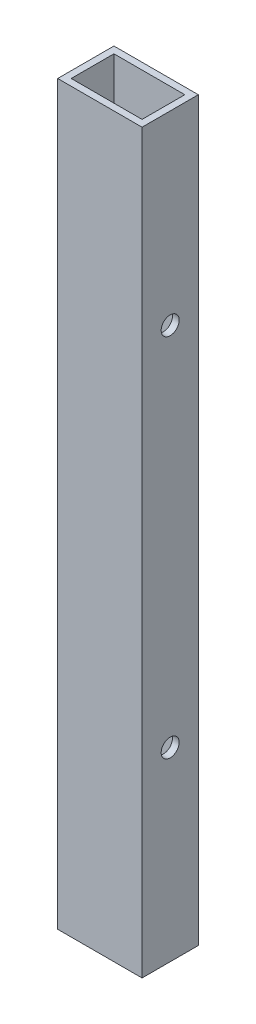
ISO-10303-21;
HEADER;
FILE_DESCRIPTION(('STEP AP214'),'2;1');
FILE_NAME('part.step','',(''),(''),'','','');
FILE_SCHEMA(('AUTOMOTIVE_DESIGN { 1 0 10303 214 1 1 1 1 }'));
ENDSEC;
DATA;
#1=APPLICATION_CONTEXT('core data for automotive mechanical design processes');
#2=APPLICATION_PROTOCOL_DEFINITION('international standard','automotive_design',2000,#1);
#3=PRODUCT_CONTEXT('',#1,'mechanical');
#4=PRODUCT('Part','Part','',(#3));
#5=PRODUCT_RELATED_PRODUCT_CATEGORY('part','',(#4));
#6=PRODUCT_DEFINITION_FORMATION('','',#4);
#7=PRODUCT_DEFINITION_CONTEXT('part definition',#1,'design');
#8=PRODUCT_DEFINITION('design','',#6,#7);
#9=PRODUCT_DEFINITION_SHAPE('','',#8);
#10=(LENGTH_UNIT() NAMED_UNIT(*) SI_UNIT(.MILLI.,.METRE.));
#11=(NAMED_UNIT(*) PLANE_ANGLE_UNIT() SI_UNIT($,.RADIAN.));
#12=(NAMED_UNIT(*) SI_UNIT($,.STERADIAN.) SOLID_ANGLE_UNIT());
#13=UNCERTAINTY_MEASURE_WITH_UNIT(LENGTH_MEASURE(1.E-05),#10,'distance_accuracy_value','');
#14=(GEOMETRIC_REPRESENTATION_CONTEXT(3) GLOBAL_UNCERTAINTY_ASSIGNED_CONTEXT((#13)) GLOBAL_UNIT_ASSIGNED_CONTEXT((#10,
#11,#12)) REPRESENTATION_CONTEXT('',''));
#15=CARTESIAN_POINT('',(0.,0.,0.));
#16=DIRECTION('',(0.,0.,1.));
#17=DIRECTION('',(1.,0.,0.));
#18=AXIS2_PLACEMENT_3D('',#15,#16,#17);
#19=CARTESIAN_POINT('',(0.,65.5,0.));
#20=DIRECTION('',(0.,1.,0.));
#21=DIRECTION('',(0.,0.,1.));
#22=AXIS2_PLACEMENT_3D('',#19,#20,#21);
#23=PLANE('',#22);
#24=DIRECTION('',(0.,0.,-1.));
#25=VECTOR('',#24,1.);
#26=CARTESIAN_POINT('',(7.5,65.5,-5.));
#27=LINE('',#26,#25);
#28=CARTESIAN_POINT('',(7.5,65.5,5.));
#29=VERTEX_POINT('',#28);
#30=CARTESIAN_POINT('',(7.5,65.5,-5.));
#31=VERTEX_POINT('',#30);
#32=EDGE_CURVE('E137',#29,#31,#27,.T.);
#33=ORIENTED_EDGE('',*,*,#32,.T.);
#34=DIRECTION('',(-1.,0.,0.));
#35=VECTOR('',#34,1.);
#36=CARTESIAN_POINT('',(-7.5,65.5,-5.));
#37=LINE('',#36,#35);
#38=CARTESIAN_POINT('',(-7.5,65.5,-5.));
#39=VERTEX_POINT('',#38);
#40=EDGE_CURVE('E140',#31,#39,#37,.T.);
#41=ORIENTED_EDGE('',*,*,#40,.T.);
#42=DIRECTION('',(0.,0.,1.));
#43=VECTOR('',#42,1.);
#44=CARTESIAN_POINT('',(-7.5,65.5,-5.));
#45=LINE('',#44,#43);
#46=CARTESIAN_POINT('',(-7.5,65.5,5.));
#47=VERTEX_POINT('',#46);
#48=EDGE_CURVE('E143',#39,#47,#45,.T.);
#49=ORIENTED_EDGE('',*,*,#48,.T.);
#50=DIRECTION('',(1.,0.,0.));
#51=VECTOR('',#50,1.);
#52=CARTESIAN_POINT('',(-7.5,65.5,5.));
#53=LINE('',#52,#51);
#54=EDGE_CURVE('E145',#47,#29,#53,.T.);
#55=ORIENTED_EDGE('',*,*,#54,.T.);
#56=EDGE_LOOP('',(#33,#41,#49,#55));
#57=FACE_BOUND('',#56,.T.);
#58=DIRECTION('',(1.,0.,0.));
#59=VECTOR('',#58,1.);
#60=CARTESIAN_POINT('',(-6.3,65.5,3.8));
#61=LINE('',#60,#59);
#62=CARTESIAN_POINT('',(-6.3,65.5,3.8));
#63=VERTEX_POINT('',#62);
#64=CARTESIAN_POINT('',(6.3,65.5,3.8));
#65=VERTEX_POINT('',#64);
#66=EDGE_CURVE('E107',#63,#65,#61,.T.);
#67=ORIENTED_EDGE('',*,*,#66,.F.);
#68=DIRECTION('',(0.,0.,1.));
#69=VECTOR('',#68,1.);
#70=CARTESIAN_POINT('',(-6.3,65.5,-3.8));
#71=LINE('',#70,#69);
#72=CARTESIAN_POINT('',(-6.3,65.5,-3.8));
#73=VERTEX_POINT('',#72);
#74=EDGE_CURVE('E99',#73,#63,#71,.T.);
#75=ORIENTED_EDGE('',*,*,#74,.F.);
#76=DIRECTION('',(-1.,0.,0.));
#77=VECTOR('',#76,1.);
#78=CARTESIAN_POINT('',(-6.3,65.5,-3.8));
#79=LINE('',#78,#77);
#80=CARTESIAN_POINT('',(6.3,65.5,-3.8));
#81=VERTEX_POINT('',#80);
#82=EDGE_CURVE('E121',#81,#73,#79,.T.);
#83=ORIENTED_EDGE('',*,*,#82,.F.);
#84=DIRECTION('',(0.,0.,-1.));
#85=VECTOR('',#84,1.);
#86=CARTESIAN_POINT('',(6.3,65.5,-3.8));
#87=LINE('',#86,#85);
#88=EDGE_CURVE('E119',#65,#81,#87,.T.);
#89=ORIENTED_EDGE('',*,*,#88,.F.);
#90=EDGE_LOOP('',(#67,#75,#83,#89));
#91=FACE_BOUND('',#90,.T.);
#92=ADVANCED_FACE('F32',(#57,#91),#23,.T.);
#93=CARTESIAN_POINT('',(0.,-65.5,0.));
#94=DIRECTION('',(0.,1.,0.));
#95=DIRECTION('',(0.,0.,1.));
#96=AXIS2_PLACEMENT_3D('',#93,#94,#95);
#97=PLANE('',#96);
#98=DIRECTION('',(0.,0.,-1.));
#99=VECTOR('',#98,1.);
#100=CARTESIAN_POINT('',(7.5,-65.5,-5.));
#101=LINE('',#100,#99);
#102=CARTESIAN_POINT('',(7.5,-65.5,5.));
#103=VERTEX_POINT('',#102);
#104=CARTESIAN_POINT('',(7.5,-65.5,-5.));
#105=VERTEX_POINT('',#104);
#106=EDGE_CURVE('E115',#103,#105,#101,.T.);
#107=ORIENTED_EDGE('',*,*,#106,.F.);
#108=DIRECTION('',(1.,0.,0.));
#109=VECTOR('',#108,1.);
#110=CARTESIAN_POINT('',(-7.5,-65.5,5.));
#111=LINE('',#110,#109);
#112=CARTESIAN_POINT('',(-7.5,-65.5,5.));
#113=VERTEX_POINT('',#112);
#114=EDGE_CURVE('E141',#113,#103,#111,.T.);
#115=ORIENTED_EDGE('',*,*,#114,.F.);
#116=DIRECTION('',(0.,0.,1.));
#117=VECTOR('',#116,1.);
#118=CARTESIAN_POINT('',(-7.5,-65.5,-5.));
#119=LINE('',#118,#117);
#120=CARTESIAN_POINT('',(-7.5,-65.5,-5.));
#121=VERTEX_POINT('',#120);
#122=EDGE_CURVE('E152',#121,#113,#119,.T.);
#123=ORIENTED_EDGE('',*,*,#122,.F.);
#124=DIRECTION('',(-1.,0.,0.));
#125=VECTOR('',#124,1.);
#126=CARTESIAN_POINT('',(-7.5,-65.5,-5.));
#127=LINE('',#126,#125);
#128=EDGE_CURVE('E150',#105,#121,#127,.T.);
#129=ORIENTED_EDGE('',*,*,#128,.F.);
#130=EDGE_LOOP('',(#107,#115,#123,#129));
#131=FACE_BOUND('',#130,.T.);
#132=DIRECTION('',(0.,0.,1.));
#133=VECTOR('',#132,1.);
#134=CARTESIAN_POINT('',(-6.3,-65.5,-3.8));
#135=LINE('',#134,#133);
#136=CARTESIAN_POINT('',(-6.3,-65.5,-3.8));
#137=VERTEX_POINT('',#136);
#138=CARTESIAN_POINT('',(-6.3,-65.5,3.8));
#139=VERTEX_POINT('',#138);
#140=EDGE_CURVE('E57',#137,#139,#135,.T.);
#141=ORIENTED_EDGE('',*,*,#140,.T.);
#142=DIRECTION('',(1.,0.,0.));
#143=VECTOR('',#142,1.);
#144=CARTESIAN_POINT('',(-6.3,-65.5,3.8));
#145=LINE('',#144,#143);
#146=CARTESIAN_POINT('',(6.3,-65.5,3.8));
#147=VERTEX_POINT('',#146);
#148=EDGE_CURVE('E114',#139,#147,#145,.T.);
#149=ORIENTED_EDGE('',*,*,#148,.T.);
#150=DIRECTION('',(0.,0.,-1.));
#151=VECTOR('',#150,1.);
#152=CARTESIAN_POINT('',(6.3,-65.5,-3.8));
#153=LINE('',#152,#151);
#154=CARTESIAN_POINT('',(6.3,-65.5,-3.8));
#155=VERTEX_POINT('',#154);
#156=EDGE_CURVE('E129',#147,#155,#153,.T.);
#157=ORIENTED_EDGE('',*,*,#156,.T.);
#158=DIRECTION('',(-1.,0.,0.));
#159=VECTOR('',#158,1.);
#160=CARTESIAN_POINT('',(-6.3,-65.5,-3.8));
#161=LINE('',#160,#159);
#162=EDGE_CURVE('E108',#155,#137,#161,.T.);
#163=ORIENTED_EDGE('',*,*,#162,.T.);
#164=EDGE_LOOP('',(#141,#149,#157,#163));
#165=FACE_BOUND('',#164,.T.);
#166=ADVANCED_FACE('F201',(#131,#165),#97,.F.);
#167=CARTESIAN_POINT('',(7.5,65.5,-5.));
#168=DIRECTION('',(-1.,0.,0.));
#169=DIRECTION('',(0.,0.,1.));
#170=AXIS2_PLACEMENT_3D('',#167,#168,#169);
#171=PLANE('',#170);
#172=CARTESIAN_POINT('',(7.5,-32.5,0.));
#173=DIRECTION('',(-1.,0.,0.));
#174=DIRECTION('',(0.,0.,1.));
#175=AXIS2_PLACEMENT_3D('',#172,#173,#174);
#176=CIRCLE('',#175,1.6);
#177=CARTESIAN_POINT('',(7.5,-32.5,1.6));
#178=VERTEX_POINT('',#177);
#179=EDGE_CURVE('E164',#178,#178,#176,.F.);
#180=ORIENTED_EDGE('',*,*,#179,.F.);
#181=EDGE_LOOP('',(#180));
#182=FACE_BOUND('',#181,.T.);
#183=CARTESIAN_POINT('',(7.5,32.5,0.));
#184=DIRECTION('',(-1.,0.,0.));
#185=DIRECTION('',(0.,0.,1.));
#186=AXIS2_PLACEMENT_3D('',#183,#184,#185);
#187=CIRCLE('',#186,1.6);
#188=CARTESIAN_POINT('',(7.5,32.5,1.6));
#189=VERTEX_POINT('',#188);
#190=EDGE_CURVE('E127',#189,#189,#187,.T.);
#191=ORIENTED_EDGE('',*,*,#190,.T.);
#192=EDGE_LOOP('',(#191));
#193=FACE_BOUND('',#192,.T.);
#194=ORIENTED_EDGE('',*,*,#106,.T.);
#195=DIRECTION('',(0.,-1.,0.));
#196=VECTOR('',#195,1.);
#197=CARTESIAN_POINT('',(7.5,65.5,-5.));
#198=LINE('',#197,#196);
#199=EDGE_CURVE('E11',#31,#105,#198,.T.);
#200=ORIENTED_EDGE('',*,*,#199,.F.);
#201=ORIENTED_EDGE('',*,*,#32,.F.);
#202=DIRECTION('',(0.,-1.,0.));
#203=VECTOR('',#202,1.);
#204=CARTESIAN_POINT('',(7.5,65.5,5.));
#205=LINE('',#204,#203);
#206=EDGE_CURVE('E147',#29,#103,#205,.T.);
#207=ORIENTED_EDGE('',*,*,#206,.T.);
#208=EDGE_LOOP('',(#194,#200,#201,#207));
#209=FACE_BOUND('',#208,.T.);
#210=ADVANCED_FACE('F34',(#182,#193,#209),#171,.F.);
#211=CARTESIAN_POINT('',(-7.5,65.5,-5.));
#212=DIRECTION('',(0.,0.,1.));
#213=DIRECTION('',(1.,0.,0.));
#214=AXIS2_PLACEMENT_3D('',#211,#212,#213);
#215=PLANE('',#214);
#216=ORIENTED_EDGE('',*,*,#128,.T.);
#217=DIRECTION('',(0.,-1.,0.));
#218=VECTOR('',#217,1.);
#219=CARTESIAN_POINT('',(-7.5,65.5,-5.));
#220=LINE('',#219,#218);
#221=EDGE_CURVE('E41',#39,#121,#220,.T.);
#222=ORIENTED_EDGE('',*,*,#221,.F.);
#223=ORIENTED_EDGE('',*,*,#40,.F.);
#224=ORIENTED_EDGE('',*,*,#199,.T.);
#225=EDGE_LOOP('',(#216,#222,#223,#224));
#226=FACE_BOUND('',#225,.T.);
#227=ADVANCED_FACE('F218',(#226),#215,.F.);
#228=CARTESIAN_POINT('',(-7.5,65.5,-5.));
#229=DIRECTION('',(1.,0.,0.));
#230=DIRECTION('',(0.,0.,-1.));
#231=AXIS2_PLACEMENT_3D('',#228,#229,#230);
#232=PLANE('',#231);
#233=CARTESIAN_POINT('',(-7.50000000000001,-32.5,0.));
#234=DIRECTION('',(1.,0.,0.));
#235=DIRECTION('',(0.,0.,-1.));
#236=AXIS2_PLACEMENT_3D('',#233,#234,#235);
#237=CIRCLE('',#236,1.6);
#238=CARTESIAN_POINT('',(-7.50000000000001,-32.5,-1.6));
#239=VERTEX_POINT('',#238);
#240=EDGE_CURVE('E171',#239,#239,#237,.F.);
#241=ORIENTED_EDGE('',*,*,#240,.F.);
#242=EDGE_LOOP('',(#241));
#243=FACE_BOUND('',#242,.T.);
#244=CARTESIAN_POINT('',(-7.50000000000001,32.5,0.));
#245=DIRECTION('',(1.,0.,0.));
#246=DIRECTION('',(0.,0.,-1.));
#247=AXIS2_PLACEMENT_3D('',#244,#245,#246);
#248=CIRCLE('',#247,1.6);
#249=CARTESIAN_POINT('',(-7.50000000000001,32.5,-1.6));
#250=VERTEX_POINT('',#249);
#251=EDGE_CURVE('E168',#250,#250,#248,.T.);
#252=ORIENTED_EDGE('',*,*,#251,.T.);
#253=EDGE_LOOP('',(#252));
#254=FACE_BOUND('',#253,.T.);
#255=ORIENTED_EDGE('',*,*,#122,.T.);
#256=DIRECTION('',(0.,-1.,0.));
#257=VECTOR('',#256,1.);
#258=CARTESIAN_POINT('',(-7.5,65.5,5.));
#259=LINE('',#258,#257);
#260=EDGE_CURVE('E157',#47,#113,#259,.T.);
#261=ORIENTED_EDGE('',*,*,#260,.F.);
#262=ORIENTED_EDGE('',*,*,#48,.F.);
#263=ORIENTED_EDGE('',*,*,#221,.T.);
#264=EDGE_LOOP('',(#255,#261,#262,#263));
#265=FACE_BOUND('',#264,.T.);
#266=ADVANCED_FACE('F215',(#243,#254,#265),#232,.F.);
#267=CARTESIAN_POINT('',(-7.5,65.5,5.));
#268=DIRECTION('',(0.,0.,-1.));
#269=DIRECTION('',(-1.,0.,0.));
#270=AXIS2_PLACEMENT_3D('',#267,#268,#269);
#271=PLANE('',#270);
#272=ORIENTED_EDGE('',*,*,#114,.T.);
#273=ORIENTED_EDGE('',*,*,#206,.F.);
#274=ORIENTED_EDGE('',*,*,#54,.F.);
#275=ORIENTED_EDGE('',*,*,#260,.T.);
#276=EDGE_LOOP('',(#272,#273,#274,#275));
#277=FACE_BOUND('',#276,.T.);
#278=ADVANCED_FACE('F212',(#277),#271,.F.);
#279=CARTESIAN_POINT('',(-6.3,65.5,-3.8));
#280=DIRECTION('',(1.,0.,0.));
#281=DIRECTION('',(0.,0.,-1.));
#282=AXIS2_PLACEMENT_3D('',#279,#280,#281);
#283=PLANE('',#282);
#284=CARTESIAN_POINT('',(-6.3,-32.5,0.));
#285=DIRECTION('',(1.,0.,0.));
#286=DIRECTION('',(0.,0.,-1.));
#287=AXIS2_PLACEMENT_3D('',#284,#285,#286);
#288=CIRCLE('',#287,1.6);
#289=CARTESIAN_POINT('',(-6.3,-32.5,-1.6));
#290=VERTEX_POINT('',#289);
#291=EDGE_CURVE('E176',#290,#290,#288,.F.);
#292=ORIENTED_EDGE('',*,*,#291,.T.);
#293=EDGE_LOOP('',(#292));
#294=FACE_BOUND('',#293,.T.);
#295=CARTESIAN_POINT('',(-6.3,32.5,0.));
#296=DIRECTION('',(1.,0.,0.));
#297=DIRECTION('',(0.,0.,-1.));
#298=AXIS2_PLACEMENT_3D('',#295,#296,#297);
#299=CIRCLE('',#298,1.6);
#300=CARTESIAN_POINT('',(-6.3,32.5,-1.6));
#301=VERTEX_POINT('',#300);
#302=EDGE_CURVE('E163',#301,#301,#299,.T.);
#303=ORIENTED_EDGE('',*,*,#302,.F.);
#304=EDGE_LOOP('',(#303));
#305=FACE_BOUND('',#304,.T.);
#306=ORIENTED_EDGE('',*,*,#140,.F.);
#307=DIRECTION('',(0.,-1.,0.));
#308=VECTOR('',#307,1.);
#309=CARTESIAN_POINT('',(-6.3,65.5,-3.8));
#310=LINE('',#309,#308);
#311=EDGE_CURVE('E103',#73,#137,#310,.T.);
#312=ORIENTED_EDGE('',*,*,#311,.F.);
#313=ORIENTED_EDGE('',*,*,#74,.T.);
#314=DIRECTION('',(0.,-1.,0.));
#315=VECTOR('',#314,1.);
#316=CARTESIAN_POINT('',(-6.3,65.5,3.8));
#317=LINE('',#316,#315);
#318=EDGE_CURVE('E102',#63,#139,#317,.T.);
#319=ORIENTED_EDGE('',*,*,#318,.T.);
#320=EDGE_LOOP('',(#306,#312,#313,#319));
#321=FACE_BOUND('',#320,.T.);
#322=ADVANCED_FACE('F101',(#294,#305,#321),#283,.T.);
#323=CARTESIAN_POINT('',(-6.3,65.5,3.8));
#324=DIRECTION('',(0.,0.,-1.));
#325=DIRECTION('',(-1.,0.,0.));
#326=AXIS2_PLACEMENT_3D('',#323,#324,#325);
#327=PLANE('',#326);
#328=ORIENTED_EDGE('',*,*,#148,.F.);
#329=ORIENTED_EDGE('',*,*,#318,.F.);
#330=ORIENTED_EDGE('',*,*,#66,.T.);
#331=DIRECTION('',(0.,-1.,0.));
#332=VECTOR('',#331,1.);
#333=CARTESIAN_POINT('',(6.3,65.5,3.8));
#334=LINE('',#333,#332);
#335=EDGE_CURVE('E116',#65,#147,#334,.T.);
#336=ORIENTED_EDGE('',*,*,#335,.T.);
#337=EDGE_LOOP('',(#328,#329,#330,#336));
#338=FACE_BOUND('',#337,.T.);
#339=ADVANCED_FACE('F111',(#338),#327,.T.);
#340=CARTESIAN_POINT('',(6.3,65.5,-3.8));
#341=DIRECTION('',(-1.,0.,0.));
#342=DIRECTION('',(0.,0.,1.));
#343=AXIS2_PLACEMENT_3D('',#340,#341,#342);
#344=PLANE('',#343);
#345=CARTESIAN_POINT('',(6.3,-32.5,0.));
#346=DIRECTION('',(-1.,0.,0.));
#347=DIRECTION('',(0.,0.,1.));
#348=AXIS2_PLACEMENT_3D('',#345,#346,#347);
#349=CIRCLE('',#348,1.6);
#350=CARTESIAN_POINT('',(6.3,-32.5,1.6));
#351=VERTEX_POINT('',#350);
#352=EDGE_CURVE('E36',#351,#351,#349,.F.);
#353=ORIENTED_EDGE('',*,*,#352,.T.);
#354=EDGE_LOOP('',(#353));
#355=FACE_BOUND('',#354,.T.);
#356=CARTESIAN_POINT('',(6.3,32.5,0.));
#357=DIRECTION('',(-1.,0.,0.));
#358=DIRECTION('',(0.,0.,1.));
#359=AXIS2_PLACEMENT_3D('',#356,#357,#358);
#360=CIRCLE('',#359,1.6);
#361=CARTESIAN_POINT('',(6.3,32.5,1.6));
#362=VERTEX_POINT('',#361);
#363=EDGE_CURVE('E161',#362,#362,#360,.T.);
#364=ORIENTED_EDGE('',*,*,#363,.F.);
#365=EDGE_LOOP('',(#364));
#366=FACE_BOUND('',#365,.T.);
#367=ORIENTED_EDGE('',*,*,#156,.F.);
#368=ORIENTED_EDGE('',*,*,#335,.F.);
#369=ORIENTED_EDGE('',*,*,#88,.T.);
#370=DIRECTION('',(0.,-1.,0.));
#371=VECTOR('',#370,1.);
#372=CARTESIAN_POINT('',(6.3,65.5,-3.8));
#373=LINE('',#372,#371);
#374=EDGE_CURVE('E49',#81,#155,#373,.T.);
#375=ORIENTED_EDGE('',*,*,#374,.T.);
#376=EDGE_LOOP('',(#367,#368,#369,#375));
#377=FACE_BOUND('',#376,.T.);
#378=ADVANCED_FACE('F197',(#355,#366,#377),#344,.T.);
#379=CARTESIAN_POINT('',(-6.3,65.5,-3.8));
#380=DIRECTION('',(0.,0.,1.));
#381=DIRECTION('',(1.,0.,0.));
#382=AXIS2_PLACEMENT_3D('',#379,#380,#381);
#383=PLANE('',#382);
#384=ORIENTED_EDGE('',*,*,#162,.F.);
#385=ORIENTED_EDGE('',*,*,#374,.F.);
#386=ORIENTED_EDGE('',*,*,#82,.T.);
#387=ORIENTED_EDGE('',*,*,#311,.T.);
#388=EDGE_LOOP('',(#384,#385,#386,#387));
#389=FACE_BOUND('',#388,.T.);
#390=ADVANCED_FACE('F189',(#389),#383,.T.);
#391=CARTESIAN_POINT('',(58.,32.5,0.));
#392=DIRECTION('',(-1.,0.,0.));
#393=DIRECTION('',(0.,0.,1.));
#394=AXIS2_PLACEMENT_3D('',#391,#392,#393);
#395=CYLINDRICAL_SURFACE('',#394,1.6);
#396=ORIENTED_EDGE('',*,*,#363,.T.);
#397=EDGE_LOOP('',(#396));
#398=FACE_BOUND('',#397,.T.);
#399=ORIENTED_EDGE('',*,*,#190,.F.);
#400=EDGE_LOOP('',(#399));
#401=FACE_BOUND('',#400,.T.);
#402=ADVANCED_FACE('F186',(#398,#401),#395,.F.);
#403=ORIENTED_EDGE('',*,*,#302,.T.);
#404=EDGE_LOOP('',(#403));
#405=FACE_BOUND('',#404,.T.);
#406=ORIENTED_EDGE('',*,*,#251,.F.);
#407=EDGE_LOOP('',(#406));
#408=FACE_BOUND('',#407,.T.);
#409=ADVANCED_FACE('F188',(#405,#408),#395,.F.);
#410=CARTESIAN_POINT('',(58.,-32.5,0.));
#411=DIRECTION('',(-1.,0.,0.));
#412=DIRECTION('',(0.,0.,1.));
#413=AXIS2_PLACEMENT_3D('',#410,#411,#412);
#414=CYLINDRICAL_SURFACE('',#413,1.6);
#415=ORIENTED_EDGE('',*,*,#352,.F.);
#416=EDGE_LOOP('',(#415));
#417=FACE_BOUND('',#416,.T.);
#418=ORIENTED_EDGE('',*,*,#179,.T.);
#419=EDGE_LOOP('',(#418));
#420=FACE_BOUND('',#419,.T.);
#421=ADVANCED_FACE('F195',(#417,#420),#414,.F.);
#422=ORIENTED_EDGE('',*,*,#291,.F.);
#423=EDGE_LOOP('',(#422));
#424=FACE_BOUND('',#423,.T.);
#425=ORIENTED_EDGE('',*,*,#240,.T.);
#426=EDGE_LOOP('',(#425));
#427=FACE_BOUND('',#426,.T.);
#428=ADVANCED_FACE('F255',(#424,#427),#414,.F.);
#429=CLOSED_SHELL('',(#92,#166,#210,#227,#266,#278,#322,#339,#378,#390,#402,#409,#421,#428));
#430=MANIFOLD_SOLID_BREP('B2',#429);
#431=ADVANCED_BREP_SHAPE_REPRESENTATION('',(#18,#430),#14);
#432=SHAPE_DEFINITION_REPRESENTATION(#9,#431);
ENDSEC;
END-ISO-10303-21;
